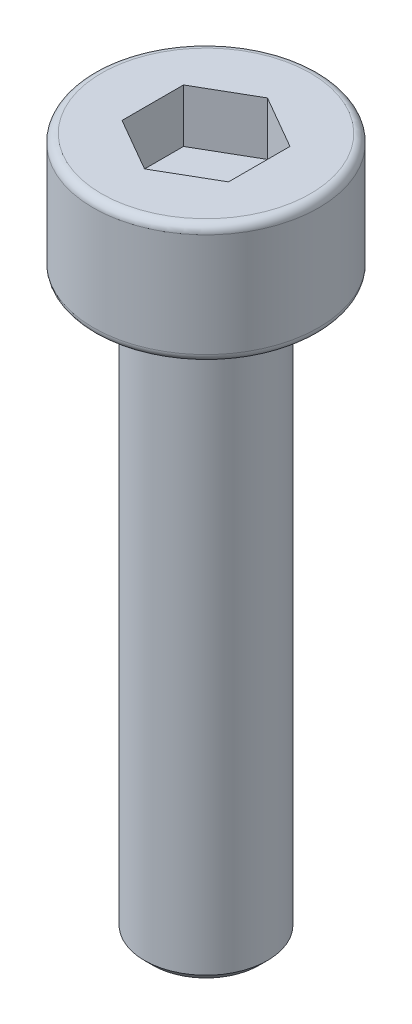
ISO-10303-21;
HEADER;
FILE_DESCRIPTION(('STEP AP214'),'2;1');
FILE_NAME('part.step','',(''),(''),'','','');
FILE_SCHEMA(('AUTOMOTIVE_DESIGN { 1 0 10303 214 1 1 1 1 }'));
ENDSEC;
DATA;
#1=APPLICATION_CONTEXT('core data for automotive mechanical design processes');
#2=APPLICATION_PROTOCOL_DEFINITION('international standard','automotive_design',2000,#1);
#3=PRODUCT_CONTEXT('',#1,'mechanical');
#4=PRODUCT('Part','Part','',(#3));
#5=PRODUCT_RELATED_PRODUCT_CATEGORY('part','',(#4));
#6=PRODUCT_DEFINITION_FORMATION('','',#4);
#7=PRODUCT_DEFINITION_CONTEXT('part definition',#1,'design');
#8=PRODUCT_DEFINITION('design','',#6,#7);
#9=PRODUCT_DEFINITION_SHAPE('','',#8);
#10=(LENGTH_UNIT() NAMED_UNIT(*) SI_UNIT(.MILLI.,.METRE.));
#11=(NAMED_UNIT(*) PLANE_ANGLE_UNIT() SI_UNIT($,.RADIAN.));
#12=(NAMED_UNIT(*) SI_UNIT($,.STERADIAN.) SOLID_ANGLE_UNIT());
#13=UNCERTAINTY_MEASURE_WITH_UNIT(LENGTH_MEASURE(1.E-05),#10,'distance_accuracy_value','');
#14=(GEOMETRIC_REPRESENTATION_CONTEXT(3) GLOBAL_UNCERTAINTY_ASSIGNED_CONTEXT((#13)) GLOBAL_UNIT_ASSIGNED_CONTEXT((#10,
#11,#12)) REPRESENTATION_CONTEXT('',''));
#15=CARTESIAN_POINT('',(0.,0.,0.));
#16=DIRECTION('',(0.,0.,1.));
#17=DIRECTION('',(1.,0.,0.));
#18=AXIS2_PLACEMENT_3D('',#15,#16,#17);
#19=CARTESIAN_POINT('',(0.,0.,0.));
#20=DIRECTION('',(0.,-1.,0.));
#21=DIRECTION('',(0.,0.,-1.));
#22=AXIS2_PLACEMENT_3D('',#19,#20,#21);
#23=PLANE('',#22);
#24=CARTESIAN_POINT('',(0.,0.,0.));
#25=DIRECTION('',(0.,-1.,0.));
#26=DIRECTION('',(0.,0.,-1.));
#27=AXIS2_PLACEMENT_3D('',#24,#25,#26);
#28=CIRCLE('',#27,2.55);
#29=CARTESIAN_POINT('',(0.,0.,-2.55));
#30=VERTEX_POINT('',#29);
#31=EDGE_CURVE('E155',#30,#30,#28,.F.);
#32=ORIENTED_EDGE('',*,*,#31,.T.);
#33=EDGE_LOOP('',(#32));
#34=FACE_BOUND('',#33,.T.);
#35=DIRECTION('',(-0.866025403784438,0.,0.5));
#36=VECTOR('',#35,1.);
#37=CARTESIAN_POINT('',(0.,0.,-1.5));
#38=LINE('',#37,#36);
#39=CARTESIAN_POINT('',(0.,0.,-1.5));
#40=VERTEX_POINT('',#39);
#41=CARTESIAN_POINT('',(-1.29903810567666,0.,-0.75));
#42=VERTEX_POINT('',#41);
#43=EDGE_CURVE('E134',#40,#42,#38,.T.);
#44=ORIENTED_EDGE('',*,*,#43,.F.);
#45=DIRECTION('',(-0.866025403784439,0.,-0.5));
#46=VECTOR('',#45,1.);
#47=CARTESIAN_POINT('',(1.29903810567666,0.,-0.750000000000001));
#48=LINE('',#47,#46);
#49=CARTESIAN_POINT('',(1.29903810567666,0.,-0.750000000000001));
#50=VERTEX_POINT('',#49);
#51=EDGE_CURVE('E60',#50,#40,#48,.T.);
#52=ORIENTED_EDGE('',*,*,#51,.F.);
#53=DIRECTION('',(0.,0.,-1.));
#54=VECTOR('',#53,1.);
#55=CARTESIAN_POINT('',(1.29903810567666,0.,0.75));
#56=LINE('',#55,#54);
#57=CARTESIAN_POINT('',(1.29903810567666,0.,0.75));
#58=VERTEX_POINT('',#57);
#59=EDGE_CURVE('E143',#58,#50,#56,.T.);
#60=ORIENTED_EDGE('',*,*,#59,.F.);
#61=DIRECTION('',(0.866025403784439,0.,-0.5));
#62=VECTOR('',#61,1.);
#63=CARTESIAN_POINT('',(0.,0.,1.5));
#64=LINE('',#63,#62);
#65=CARTESIAN_POINT('',(0.,0.,1.5));
#66=VERTEX_POINT('',#65);
#67=EDGE_CURVE('E141',#66,#58,#64,.T.);
#68=ORIENTED_EDGE('',*,*,#67,.F.);
#69=DIRECTION('',(0.866025403784439,0.,0.5));
#70=VECTOR('',#69,1.);
#71=CARTESIAN_POINT('',(-1.29903810567666,0.,0.75));
#72=LINE('',#71,#70);
#73=CARTESIAN_POINT('',(-1.29903810567666,0.,0.75));
#74=VERTEX_POINT('',#73);
#75=EDGE_CURVE('E108',#74,#66,#72,.T.);
#76=ORIENTED_EDGE('',*,*,#75,.F.);
#77=DIRECTION('',(0.,0.,1.));
#78=VECTOR('',#77,1.);
#79=CARTESIAN_POINT('',(-1.29903810567666,0.,-0.75));
#80=LINE('',#79,#78);
#81=EDGE_CURVE('E137',#42,#74,#80,.T.);
#82=ORIENTED_EDGE('',*,*,#81,.F.);
#83=EDGE_LOOP('',(#44,#52,#60,#68,#76,#82));
#84=FACE_BOUND('',#83,.T.);
#85=ADVANCED_FACE('F45',(#34,#84),#23,.F.);
#86=CARTESIAN_POINT('',(0.,0.,0.));
#87=DIRECTION('',(0.,1.,0.));
#88=DIRECTION('',(0.,0.,1.));
#89=AXIS2_PLACEMENT_3D('',#86,#87,#88);
#90=CYLINDRICAL_SURFACE('',#89,2.75);
#91=CARTESIAN_POINT('',(0.,-0.2,0.));
#92=DIRECTION('',(0.,-1.,0.));
#93=DIRECTION('',(0.,0.,-1.));
#94=AXIS2_PLACEMENT_3D('',#91,#92,#93);
#95=CIRCLE('',#94,2.75);
#96=CARTESIAN_POINT('',(0.,-0.2,-2.75));
#97=VERTEX_POINT('',#96);
#98=EDGE_CURVE('E161',#97,#97,#95,.T.);
#99=ORIENTED_EDGE('',*,*,#98,.T.);
#100=EDGE_LOOP('',(#99));
#101=FACE_BOUND('',#100,.T.);
#102=CARTESIAN_POINT('',(0.,-2.73,0.));
#103=DIRECTION('',(0.,1.,0.));
#104=DIRECTION('',(0.,0.,1.));
#105=AXIS2_PLACEMENT_3D('',#102,#103,#104);
#106=CIRCLE('',#105,2.75);
#107=CARTESIAN_POINT('',(0.,-2.73,2.75));
#108=VERTEX_POINT('',#107);
#109=EDGE_CURVE('E158',#108,#108,#106,.T.);
#110=ORIENTED_EDGE('',*,*,#109,.T.);
#111=EDGE_LOOP('',(#110));
#112=FACE_BOUND('',#111,.T.);
#113=ADVANCED_FACE('F183',(#101,#112),#90,.T.);
#114=CARTESIAN_POINT('',(2.75,-2.93,0.));
#115=DIRECTION('',(0.,1.,0.));
#116=DIRECTION('',(0.,0.,1.));
#117=AXIS2_PLACEMENT_3D('',#114,#115,#116);
#118=PLANE('',#117);
#119=CARTESIAN_POINT('',(0.,-2.93,0.));
#120=DIRECTION('',(0.,1.,0.));
#121=DIRECTION('',(0.,0.,1.));
#122=AXIS2_PLACEMENT_3D('',#119,#120,#121);
#123=CIRCLE('',#122,2.55);
#124=CARTESIAN_POINT('',(0.,-2.93,2.55));
#125=VERTEX_POINT('',#124);
#126=EDGE_CURVE('E164',#125,#125,#123,.F.);
#127=ORIENTED_EDGE('',*,*,#126,.T.);
#128=EDGE_LOOP('',(#127));
#129=FACE_BOUND('',#128,.T.);
#130=CARTESIAN_POINT('',(0.,-2.93,0.));
#131=DIRECTION('',(0.,1.,0.));
#132=DIRECTION('',(0.,0.,1.));
#133=AXIS2_PLACEMENT_3D('',#130,#131,#132);
#134=CIRCLE('',#133,1.5);
#135=CARTESIAN_POINT('',(0.,-2.93,1.5));
#136=VERTEX_POINT('',#135);
#137=EDGE_CURVE('E147',#136,#136,#134,.T.);
#138=ORIENTED_EDGE('',*,*,#137,.T.);
#139=EDGE_LOOP('',(#138));
#140=FACE_BOUND('',#139,.T.);
#141=ADVANCED_FACE('F190',(#129,#140),#118,.F.);
#142=CARTESIAN_POINT('',(0.,0.,0.));
#143=DIRECTION('',(0.,1.,0.));
#144=DIRECTION('',(0.,0.,1.));
#145=AXIS2_PLACEMENT_3D('',#142,#143,#144);
#146=CYLINDRICAL_SURFACE('',#145,1.5);
#147=CARTESIAN_POINT('',(0.,-16.73,0.));
#148=DIRECTION('',(0.,1.,0.));
#149=DIRECTION('',(0.,0.,1.));
#150=AXIS2_PLACEMENT_3D('',#147,#148,#149);
#151=CIRCLE('',#150,1.5);
#152=CARTESIAN_POINT('',(0.,-16.73,1.5));
#153=VERTEX_POINT('',#152);
#154=EDGE_CURVE('E53',#153,#153,#151,.T.);
#155=ORIENTED_EDGE('',*,*,#154,.T.);
#156=EDGE_LOOP('',(#155));
#157=FACE_BOUND('',#156,.T.);
#158=ORIENTED_EDGE('',*,*,#137,.F.);
#159=EDGE_LOOP('',(#158));
#160=FACE_BOUND('',#159,.T.);
#161=ADVANCED_FACE('F169',(#157,#160),#146,.T.);
#162=CARTESIAN_POINT('',(1.5,-16.93,0.));
#163=DIRECTION('',(0.,1.,0.));
#164=DIRECTION('',(0.,0.,1.));
#165=AXIS2_PLACEMENT_3D('',#162,#163,#164);
#166=PLANE('',#165);
#167=CARTESIAN_POINT('',(0.,-16.93,0.));
#168=DIRECTION('',(0.,1.,0.));
#169=DIRECTION('',(0.,0.,1.));
#170=AXIS2_PLACEMENT_3D('',#167,#168,#169);
#171=CIRCLE('',#170,1.3);
#172=CARTESIAN_POINT('',(0.,-16.93,1.3));
#173=VERTEX_POINT('',#172);
#174=EDGE_CURVE('E11',#173,#173,#171,.F.);
#175=ORIENTED_EDGE('',*,*,#174,.T.);
#176=EDGE_LOOP('',(#175));
#177=FACE_BOUND('',#176,.T.);
#178=ADVANCED_FACE('F229',(#177),#166,.F.);
#179=CARTESIAN_POINT('',(1.29903810567666,-1.3,-0.750000000000001));
#180=DIRECTION('',(0.5,0.,-0.866025403784439));
#181=DIRECTION('',(-0.866025403784439,0.,-0.5));
#182=AXIS2_PLACEMENT_3D('',#179,#180,#181);
#183=PLANE('',#182);
#184=ORIENTED_EDGE('',*,*,#51,.T.);
#185=DIRECTION('',(0.,1.,0.));
#186=VECTOR('',#185,1.);
#187=CARTESIAN_POINT('',(0.,-1.3,-1.5));
#188=LINE('',#187,#186);
#189=CARTESIAN_POINT('',(0.,-1.3,-1.5));
#190=VERTEX_POINT('',#189);
#191=EDGE_CURVE('E90',#190,#40,#188,.T.);
#192=ORIENTED_EDGE('',*,*,#191,.F.);
#193=DIRECTION('',(-0.866025403784439,0.,-0.5));
#194=VECTOR('',#193,1.);
#195=CARTESIAN_POINT('',(1.29903810567666,-1.3,-0.750000000000001));
#196=LINE('',#195,#194);
#197=CARTESIAN_POINT('',(1.29903810567666,-1.3,-0.750000000000001));
#198=VERTEX_POINT('',#197);
#199=EDGE_CURVE('E145',#198,#190,#196,.T.);
#200=ORIENTED_EDGE('',*,*,#199,.F.);
#201=DIRECTION('',(0.,1.,0.));
#202=VECTOR('',#201,1.);
#203=CARTESIAN_POINT('',(1.29903810567666,-1.3,-0.750000000000001));
#204=LINE('',#203,#202);
#205=EDGE_CURVE('E68',#198,#50,#204,.T.);
#206=ORIENTED_EDGE('',*,*,#205,.T.);
#207=EDGE_LOOP('',(#184,#192,#200,#206));
#208=FACE_BOUND('',#207,.T.);
#209=ADVANCED_FACE('F219',(#208),#183,.F.);
#210=CARTESIAN_POINT('',(1.29903810567666,-1.3,0.75));
#211=DIRECTION('',(1.,0.,0.));
#212=DIRECTION('',(0.,0.,-1.));
#213=AXIS2_PLACEMENT_3D('',#210,#211,#212);
#214=PLANE('',#213);
#215=ORIENTED_EDGE('',*,*,#59,.T.);
#216=ORIENTED_EDGE('',*,*,#205,.F.);
#217=DIRECTION('',(0.,0.,-1.));
#218=VECTOR('',#217,1.);
#219=CARTESIAN_POINT('',(1.29903810567666,-1.3,0.75));
#220=LINE('',#219,#218);
#221=CARTESIAN_POINT('',(1.29903810567666,-1.3,0.75));
#222=VERTEX_POINT('',#221);
#223=EDGE_CURVE('E120',#222,#198,#220,.T.);
#224=ORIENTED_EDGE('',*,*,#223,.F.);
#225=DIRECTION('',(0.,1.,0.));
#226=VECTOR('',#225,1.);
#227=CARTESIAN_POINT('',(1.29903810567666,-1.3,0.75));
#228=LINE('',#227,#226);
#229=EDGE_CURVE('E112',#222,#58,#228,.T.);
#230=ORIENTED_EDGE('',*,*,#229,.T.);
#231=EDGE_LOOP('',(#215,#216,#224,#230));
#232=FACE_BOUND('',#231,.T.);
#233=ADVANCED_FACE('F216',(#232),#214,.F.);
#234=CARTESIAN_POINT('',(0.,-1.3,1.5));
#235=DIRECTION('',(0.5,0.,0.866025403784439));
#236=DIRECTION('',(0.866025403784439,0.,-0.5));
#237=AXIS2_PLACEMENT_3D('',#234,#235,#236);
#238=PLANE('',#237);
#239=ORIENTED_EDGE('',*,*,#67,.T.);
#240=ORIENTED_EDGE('',*,*,#229,.F.);
#241=DIRECTION('',(0.866025403784439,0.,-0.5));
#242=VECTOR('',#241,1.);
#243=CARTESIAN_POINT('',(0.,-1.3,1.5));
#244=LINE('',#243,#242);
#245=CARTESIAN_POINT('',(0.,-1.3,1.5));
#246=VERTEX_POINT('',#245);
#247=EDGE_CURVE('E116',#246,#222,#244,.T.);
#248=ORIENTED_EDGE('',*,*,#247,.F.);
#249=DIRECTION('',(0.,1.,0.));
#250=VECTOR('',#249,1.);
#251=CARTESIAN_POINT('',(0.,-1.3,1.5));
#252=LINE('',#251,#250);
#253=EDGE_CURVE('E101',#246,#66,#252,.T.);
#254=ORIENTED_EDGE('',*,*,#253,.T.);
#255=EDGE_LOOP('',(#239,#240,#248,#254));
#256=FACE_BOUND('',#255,.T.);
#257=ADVANCED_FACE('F117',(#256),#238,.F.);
#258=CARTESIAN_POINT('',(-1.29903810567666,-1.3,0.75));
#259=DIRECTION('',(-0.5,0.,0.866025403784439));
#260=DIRECTION('',(0.866025403784439,0.,0.5));
#261=AXIS2_PLACEMENT_3D('',#258,#259,#260);
#262=PLANE('',#261);
#263=ORIENTED_EDGE('',*,*,#75,.T.);
#264=ORIENTED_EDGE('',*,*,#253,.F.);
#265=DIRECTION('',(0.866025403784439,0.,0.5));
#266=VECTOR('',#265,1.);
#267=CARTESIAN_POINT('',(-1.29903810567666,-1.3,0.75));
#268=LINE('',#267,#266);
#269=CARTESIAN_POINT('',(-1.29903810567666,-1.3,0.75));
#270=VERTEX_POINT('',#269);
#271=EDGE_CURVE('E105',#270,#246,#268,.T.);
#272=ORIENTED_EDGE('',*,*,#271,.F.);
#273=DIRECTION('',(0.,1.,0.));
#274=VECTOR('',#273,1.);
#275=CARTESIAN_POINT('',(-1.29903810567666,-1.3,0.75));
#276=LINE('',#275,#274);
#277=EDGE_CURVE('E113',#270,#74,#276,.T.);
#278=ORIENTED_EDGE('',*,*,#277,.T.);
#279=EDGE_LOOP('',(#263,#264,#272,#278));
#280=FACE_BOUND('',#279,.T.);
#281=ADVANCED_FACE('F103',(#280),#262,.F.);
#282=CARTESIAN_POINT('',(-1.29903810567666,-1.3,-0.75));
#283=DIRECTION('',(-1.,0.,0.));
#284=DIRECTION('',(0.,0.,1.));
#285=AXIS2_PLACEMENT_3D('',#282,#283,#284);
#286=PLANE('',#285);
#287=ORIENTED_EDGE('',*,*,#81,.T.);
#288=ORIENTED_EDGE('',*,*,#277,.F.);
#289=DIRECTION('',(0.,0.,1.));
#290=VECTOR('',#289,1.);
#291=CARTESIAN_POINT('',(-1.29903810567666,-1.3,-0.75));
#292=LINE('',#291,#290);
#293=CARTESIAN_POINT('',(-1.29903810567666,-1.3,-0.75));
#294=VERTEX_POINT('',#293);
#295=EDGE_CURVE('E126',#294,#270,#292,.T.);
#296=ORIENTED_EDGE('',*,*,#295,.F.);
#297=DIRECTION('',(0.,1.,0.));
#298=VECTOR('',#297,1.);
#299=CARTESIAN_POINT('',(-1.29903810567666,-1.3,-0.75));
#300=LINE('',#299,#298);
#301=EDGE_CURVE('E150',#294,#42,#300,.T.);
#302=ORIENTED_EDGE('',*,*,#301,.T.);
#303=EDGE_LOOP('',(#287,#288,#296,#302));
#304=FACE_BOUND('',#303,.T.);
#305=ADVANCED_FACE('F212',(#304),#286,.F.);
#306=CARTESIAN_POINT('',(0.,-1.3,-1.5));
#307=DIRECTION('',(-0.5,0.,-0.866025403784438));
#308=DIRECTION('',(-0.866025403784439,0.,0.5));
#309=AXIS2_PLACEMENT_3D('',#306,#307,#308);
#310=PLANE('',#309);
#311=ORIENTED_EDGE('',*,*,#43,.T.);
#312=ORIENTED_EDGE('',*,*,#301,.F.);
#313=DIRECTION('',(-0.866025403784438,0.,0.5));
#314=VECTOR('',#313,1.);
#315=CARTESIAN_POINT('',(0.,-1.3,-1.5));
#316=LINE('',#315,#314);
#317=EDGE_CURVE('E128',#190,#294,#316,.T.);
#318=ORIENTED_EDGE('',*,*,#317,.F.);
#319=ORIENTED_EDGE('',*,*,#191,.T.);
#320=EDGE_LOOP('',(#311,#312,#318,#319));
#321=FACE_BOUND('',#320,.T.);
#322=ADVANCED_FACE('F201',(#321),#310,.F.);
#323=CARTESIAN_POINT('',(0.,-1.3,0.));
#324=DIRECTION('',(0.,1.,0.));
#325=DIRECTION('',(0.,0.,1.));
#326=AXIS2_PLACEMENT_3D('',#323,#324,#325);
#327=PLANE('',#326);
#328=ORIENTED_EDGE('',*,*,#199,.T.);
#329=ORIENTED_EDGE('',*,*,#317,.T.);
#330=ORIENTED_EDGE('',*,*,#295,.T.);
#331=ORIENTED_EDGE('',*,*,#271,.T.);
#332=ORIENTED_EDGE('',*,*,#247,.T.);
#333=ORIENTED_EDGE('',*,*,#223,.T.);
#334=EDGE_LOOP('',(#328,#329,#330,#331,#332,#333));
#335=FACE_BOUND('',#334,.T.);
#336=ADVANCED_FACE('F123',(#335),#327,.T.);
#337=CARTESIAN_POINT('',(0.,-0.2,0.));
#338=DIRECTION('',(0.,-1.,0.));
#339=DIRECTION('',(0.,0.,-1.));
#340=AXIS2_PLACEMENT_3D('',#337,#338,#339);
#341=TOROIDAL_SURFACE('',#340,2.55,0.2);
#342=ORIENTED_EDGE('',*,*,#98,.F.);
#343=EDGE_LOOP('',(#342));
#344=FACE_BOUND('',#343,.T.);
#345=ORIENTED_EDGE('',*,*,#31,.F.);
#346=EDGE_LOOP('',(#345));
#347=FACE_BOUND('',#346,.T.);
#348=ADVANCED_FACE('F179',(#344,#347),#341,.T.);
#349=CARTESIAN_POINT('',(0.,-2.73,0.));
#350=DIRECTION('',(0.,1.,0.));
#351=DIRECTION('',(0.,0.,1.));
#352=AXIS2_PLACEMENT_3D('',#349,#350,#351);
#353=TOROIDAL_SURFACE('',#352,2.55,0.2);
#354=ORIENTED_EDGE('',*,*,#126,.F.);
#355=EDGE_LOOP('',(#354));
#356=FACE_BOUND('',#355,.T.);
#357=ORIENTED_EDGE('',*,*,#109,.F.);
#358=EDGE_LOOP('',(#357));
#359=FACE_BOUND('',#358,.T.);
#360=ADVANCED_FACE('F173',(#356,#359),#353,.T.);
#361=CARTESIAN_POINT('',(0.,-16.73,0.));
#362=DIRECTION('',(0.,1.,0.));
#363=DIRECTION('',(0.,0.,1.));
#364=AXIS2_PLACEMENT_3D('',#361,#362,#363);
#365=CONICAL_SURFACE('',#364,1.5,0.785398163397448);
#366=ORIENTED_EDGE('',*,*,#174,.F.);
#367=EDGE_LOOP('',(#366));
#368=FACE_BOUND('',#367,.T.);
#369=ORIENTED_EDGE('',*,*,#154,.F.);
#370=EDGE_LOOP('',(#369));
#371=FACE_BOUND('',#370,.T.);
#372=ADVANCED_FACE('F47',(#368,#371),#365,.T.);
#373=CLOSED_SHELL('',(#85,#113,#141,#161,#178,#209,#233,#257,#281,#305,#322,#336,#348,#360,#372));
#374=MANIFOLD_SOLID_BREP('B2',#373);
#375=ADVANCED_BREP_SHAPE_REPRESENTATION('',(#18,#374),#14);
#376=SHAPE_DEFINITION_REPRESENTATION(#9,#375);
ENDSEC;
END-ISO-10303-21;
